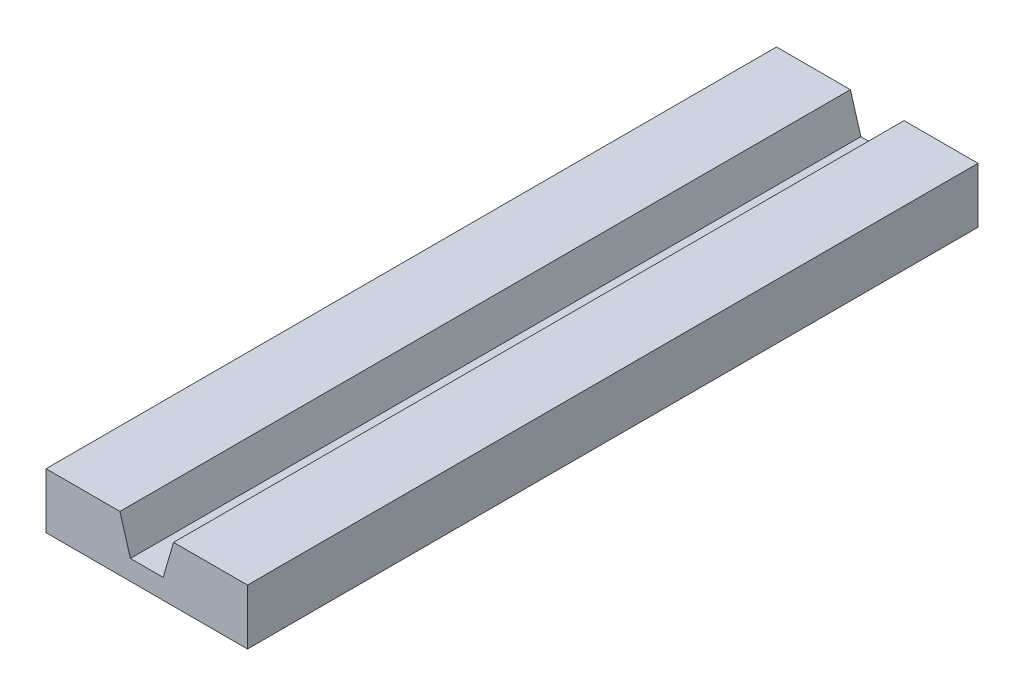
ISO-10303-21;
HEADER;
FILE_DESCRIPTION(('STEP AP214'),'2;1');
FILE_NAME('part.step','',(''),(''),'','','');
FILE_SCHEMA(('AUTOMOTIVE_DESIGN { 1 0 10303 214 1 1 1 1 }'));
ENDSEC;
DATA;
#1=APPLICATION_CONTEXT('core data for automotive mechanical design processes');
#2=APPLICATION_PROTOCOL_DEFINITION('international standard','automotive_design',2000,#1);
#3=PRODUCT_CONTEXT('',#1,'mechanical');
#4=PRODUCT('Part','Part','',(#3));
#5=PRODUCT_RELATED_PRODUCT_CATEGORY('part','',(#4));
#6=PRODUCT_DEFINITION_FORMATION('','',#4);
#7=PRODUCT_DEFINITION_CONTEXT('part definition',#1,'design');
#8=PRODUCT_DEFINITION('design','',#6,#7);
#9=PRODUCT_DEFINITION_SHAPE('','',#8);
#10=(LENGTH_UNIT() NAMED_UNIT(*) SI_UNIT(.MILLI.,.METRE.));
#11=(NAMED_UNIT(*) PLANE_ANGLE_UNIT() SI_UNIT($,.RADIAN.));
#12=(NAMED_UNIT(*) SI_UNIT($,.STERADIAN.) SOLID_ANGLE_UNIT());
#13=UNCERTAINTY_MEASURE_WITH_UNIT(LENGTH_MEASURE(1.E-05),#10,'distance_accuracy_value','');
#14=(GEOMETRIC_REPRESENTATION_CONTEXT(3) GLOBAL_UNCERTAINTY_ASSIGNED_CONTEXT((#13)) GLOBAL_UNIT_ASSIGNED_CONTEXT((#10,
#11,#12)) REPRESENTATION_CONTEXT('',''));
#15=CARTESIAN_POINT('',(0.,0.,0.));
#16=DIRECTION('',(0.,0.,1.));
#17=DIRECTION('',(1.,0.,0.));
#18=AXIS2_PLACEMENT_3D('',#15,#16,#17);
#19=CARTESIAN_POINT('',(-40.,-7.9,-290.));
#20=DIRECTION('',(0.,-1.,0.));
#21=DIRECTION('',(0.,0.,-1.));
#22=AXIS2_PLACEMENT_3D('',#19,#20,#21);
#23=PLANE('',#22);
#24=DIRECTION('',(1.,0.,0.));
#25=VECTOR('',#24,1.);
#26=CARTESIAN_POINT('',(-40.,-7.9,0.));
#27=LINE('',#26,#25);
#28=CARTESIAN_POINT('',(-40.,-7.9,0.));
#29=VERTEX_POINT('',#28);
#30=CARTESIAN_POINT('',(40.,-7.9,0.));
#31=VERTEX_POINT('',#30);
#32=EDGE_CURVE('E136',#29,#31,#27,.T.);
#33=ORIENTED_EDGE('',*,*,#32,.F.);
#34=DIRECTION('',(0.,0.,1.));
#35=VECTOR('',#34,1.);
#36=CARTESIAN_POINT('',(-40.,-7.9,-290.));
#37=LINE('',#36,#35);
#38=CARTESIAN_POINT('',(-40.,-7.9,-290.));
#39=VERTEX_POINT('',#38);
#40=EDGE_CURVE('E11',#39,#29,#37,.T.);
#41=ORIENTED_EDGE('',*,*,#40,.F.);
#42=DIRECTION('',(1.,0.,0.));
#43=VECTOR('',#42,1.);
#44=CARTESIAN_POINT('',(-40.,-7.9,-290.));
#45=LINE('',#44,#43);
#46=CARTESIAN_POINT('',(40.,-7.9,-290.));
#47=VERTEX_POINT('',#46);
#48=EDGE_CURVE('E156',#39,#47,#45,.T.);
#49=ORIENTED_EDGE('',*,*,#48,.T.);
#50=DIRECTION('',(0.,0.,1.));
#51=VECTOR('',#50,1.);
#52=CARTESIAN_POINT('',(40.,-7.9,-290.));
#53=LINE('',#52,#51);
#54=EDGE_CURVE('E42',#47,#31,#53,.T.);
#55=ORIENTED_EDGE('',*,*,#54,.T.);
#56=EDGE_LOOP('',(#33,#41,#49,#55));
#57=FACE_BOUND('',#56,.T.);
#58=ADVANCED_FACE('F39',(#57),#23,.T.);
#59=CARTESIAN_POINT('',(-40.,14.1,-290.));
#60=DIRECTION('',(-1.,0.,0.));
#61=DIRECTION('',(0.,-1.,0.));
#62=AXIS2_PLACEMENT_3D('',#59,#60,#61);
#63=PLANE('',#62);
#64=DIRECTION('',(0.,-1.,0.));
#65=VECTOR('',#64,1.);
#66=CARTESIAN_POINT('',(-40.,14.1,0.));
#67=LINE('',#66,#65);
#68=CARTESIAN_POINT('',(-40.,14.1,0.));
#69=VERTEX_POINT('',#68);
#70=EDGE_CURVE('E154',#69,#29,#67,.T.);
#71=ORIENTED_EDGE('',*,*,#70,.F.);
#72=DIRECTION('',(0.,0.,1.));
#73=VECTOR('',#72,1.);
#74=CARTESIAN_POINT('',(-40.,14.1,-290.));
#75=LINE('',#74,#73);
#76=CARTESIAN_POINT('',(-40.,14.1,-290.));
#77=VERTEX_POINT('',#76);
#78=EDGE_CURVE('E48',#77,#69,#75,.T.);
#79=ORIENTED_EDGE('',*,*,#78,.F.);
#80=DIRECTION('',(0.,-1.,0.));
#81=VECTOR('',#80,1.);
#82=CARTESIAN_POINT('',(-40.,14.1,-290.));
#83=LINE('',#82,#81);
#84=EDGE_CURVE('E126',#77,#39,#83,.T.);
#85=ORIENTED_EDGE('',*,*,#84,.T.);
#86=ORIENTED_EDGE('',*,*,#40,.T.);
#87=EDGE_LOOP('',(#71,#79,#85,#86));
#88=FACE_BOUND('',#87,.T.);
#89=ADVANCED_FACE('F168',(#88),#63,.T.);
#90=CARTESIAN_POINT('',(-40.,14.1,-290.));
#91=DIRECTION('',(0.,1.,0.));
#92=DIRECTION('',(0.,0.,1.));
#93=AXIS2_PLACEMENT_3D('',#90,#91,#92);
#94=PLANE('',#93);
#95=DIRECTION('',(-1.,0.,0.));
#96=VECTOR('',#95,1.);
#97=CARTESIAN_POINT('',(-40.,14.1,0.));
#98=LINE('',#97,#96);
#99=CARTESIAN_POINT('',(-10.65,14.1,0.));
#100=VERTEX_POINT('',#99);
#101=EDGE_CURVE('E113',#100,#69,#98,.T.);
#102=ORIENTED_EDGE('',*,*,#101,.F.);
#103=DIRECTION('',(0.,0.,1.));
#104=VECTOR('',#103,1.);
#105=CARTESIAN_POINT('',(-10.65,14.1,-290.));
#106=LINE('',#105,#104);
#107=CARTESIAN_POINT('',(-10.65,14.1,-290.));
#108=VERTEX_POINT('',#107);
#109=EDGE_CURVE('E108',#108,#100,#106,.T.);
#110=ORIENTED_EDGE('',*,*,#109,.F.);
#111=DIRECTION('',(-1.,0.,0.));
#112=VECTOR('',#111,1.);
#113=CARTESIAN_POINT('',(-40.,14.1,-290.));
#114=LINE('',#113,#112);
#115=EDGE_CURVE('E111',#108,#77,#114,.T.);
#116=ORIENTED_EDGE('',*,*,#115,.T.);
#117=ORIENTED_EDGE('',*,*,#78,.T.);
#118=EDGE_LOOP('',(#102,#110,#116,#117));
#119=FACE_BOUND('',#118,.T.);
#120=ADVANCED_FACE('F110',(#119),#94,.T.);
#121=CARTESIAN_POINT('',(-10.65,14.1,-290.));
#122=DIRECTION('',(0.959311314893196,0.282350493390551,0.));
#123=DIRECTION('',(-0.282350493390551,0.959311314893196,0.));
#124=AXIS2_PLACEMENT_3D('',#121,#122,#123);
#125=PLANE('',#124);
#126=DIRECTION('',(-0.282350493390551,0.959311314893196,0.));
#127=VECTOR('',#126,1.);
#128=CARTESIAN_POINT('',(-10.65,14.1,0.));
#129=LINE('',#128,#127);
#130=CARTESIAN_POINT('',(-6.5,0.,0.));
#131=VERTEX_POINT('',#130);
#132=EDGE_CURVE('E151',#131,#100,#129,.T.);
#133=ORIENTED_EDGE('',*,*,#132,.F.);
#134=DIRECTION('',(0.,0.,1.));
#135=VECTOR('',#134,1.);
#136=CARTESIAN_POINT('',(-6.5,0.,-290.));
#137=LINE('',#136,#135);
#138=CARTESIAN_POINT('',(-6.5,0.,-290.));
#139=VERTEX_POINT('',#138);
#140=EDGE_CURVE('E118',#139,#131,#137,.T.);
#141=ORIENTED_EDGE('',*,*,#140,.F.);
#142=DIRECTION('',(-0.282350493390551,0.959311314893196,0.));
#143=VECTOR('',#142,1.);
#144=CARTESIAN_POINT('',(-10.65,14.1,-290.));
#145=LINE('',#144,#143);
#146=EDGE_CURVE('E124',#139,#108,#145,.T.);
#147=ORIENTED_EDGE('',*,*,#146,.T.);
#148=ORIENTED_EDGE('',*,*,#109,.T.);
#149=EDGE_LOOP('',(#133,#141,#147,#148));
#150=FACE_BOUND('',#149,.T.);
#151=ADVANCED_FACE('F128',(#150),#125,.T.);
#152=CARTESIAN_POINT('',(-6.5,0.,-290.));
#153=DIRECTION('',(0.,1.,0.));
#154=DIRECTION('',(0.,0.,1.));
#155=AXIS2_PLACEMENT_3D('',#152,#153,#154);
#156=PLANE('',#155);
#157=DIRECTION('',(-1.,0.,0.));
#158=VECTOR('',#157,1.);
#159=CARTESIAN_POINT('',(-6.5,0.,0.));
#160=LINE('',#159,#158);
#161=CARTESIAN_POINT('',(6.5,0.,0.));
#162=VERTEX_POINT('',#161);
#163=EDGE_CURVE('E148',#162,#131,#160,.T.);
#164=ORIENTED_EDGE('',*,*,#163,.F.);
#165=DIRECTION('',(0.,0.,1.));
#166=VECTOR('',#165,1.);
#167=CARTESIAN_POINT('',(6.5,0.,-290.));
#168=LINE('',#167,#166);
#169=CARTESIAN_POINT('',(6.5,0.,-290.));
#170=VERTEX_POINT('',#169);
#171=EDGE_CURVE('E160',#170,#162,#168,.T.);
#172=ORIENTED_EDGE('',*,*,#171,.F.);
#173=DIRECTION('',(-1.,0.,0.));
#174=VECTOR('',#173,1.);
#175=CARTESIAN_POINT('',(-6.5,0.,-290.));
#176=LINE('',#175,#174);
#177=EDGE_CURVE('E129',#170,#139,#176,.T.);
#178=ORIENTED_EDGE('',*,*,#177,.T.);
#179=ORIENTED_EDGE('',*,*,#140,.T.);
#180=EDGE_LOOP('',(#164,#172,#178,#179));
#181=FACE_BOUND('',#180,.T.);
#182=ADVANCED_FACE('F181',(#181),#156,.T.);
#183=CARTESIAN_POINT('',(6.5,0.,-290.));
#184=DIRECTION('',(-0.959311314893196,0.282350493390551,0.));
#185=DIRECTION('',(-0.282350493390551,-0.959311314893196,0.));
#186=AXIS2_PLACEMENT_3D('',#183,#184,#185);
#187=PLANE('',#186);
#188=DIRECTION('',(-0.282350493390551,-0.959311314893196,0.));
#189=VECTOR('',#188,1.);
#190=CARTESIAN_POINT('',(6.5,0.,0.));
#191=LINE('',#190,#189);
#192=CARTESIAN_POINT('',(10.65,14.1,0.));
#193=VERTEX_POINT('',#192);
#194=EDGE_CURVE('E145',#193,#162,#191,.T.);
#195=ORIENTED_EDGE('',*,*,#194,.F.);
#196=DIRECTION('',(0.,0.,1.));
#197=VECTOR('',#196,1.);
#198=CARTESIAN_POINT('',(10.65,14.1,-290.));
#199=LINE('',#198,#197);
#200=CARTESIAN_POINT('',(10.65,14.1,-290.));
#201=VERTEX_POINT('',#200);
#202=EDGE_CURVE('E162',#201,#193,#199,.T.);
#203=ORIENTED_EDGE('',*,*,#202,.F.);
#204=DIRECTION('',(-0.282350493390551,-0.959311314893196,0.));
#205=VECTOR('',#204,1.);
#206=CARTESIAN_POINT('',(6.5,0.,-290.));
#207=LINE('',#206,#205);
#208=EDGE_CURVE('E131',#201,#170,#207,.T.);
#209=ORIENTED_EDGE('',*,*,#208,.T.);
#210=ORIENTED_EDGE('',*,*,#171,.T.);
#211=EDGE_LOOP('',(#195,#203,#209,#210));
#212=FACE_BOUND('',#211,.T.);
#213=ADVANCED_FACE('F184',(#212),#187,.T.);
#214=CARTESIAN_POINT('',(10.65,14.1,-290.));
#215=DIRECTION('',(0.,1.,0.));
#216=DIRECTION('',(0.,0.,1.));
#217=AXIS2_PLACEMENT_3D('',#214,#215,#216);
#218=PLANE('',#217);
#219=DIRECTION('',(-1.,0.,0.));
#220=VECTOR('',#219,1.);
#221=CARTESIAN_POINT('',(10.65,14.1,0.));
#222=LINE('',#221,#220);
#223=CARTESIAN_POINT('',(40.,14.1,0.));
#224=VERTEX_POINT('',#223);
#225=EDGE_CURVE('E142',#224,#193,#222,.T.);
#226=ORIENTED_EDGE('',*,*,#225,.F.);
#227=DIRECTION('',(0.,0.,1.));
#228=VECTOR('',#227,1.);
#229=CARTESIAN_POINT('',(40.,14.1,-290.));
#230=LINE('',#229,#228);
#231=CARTESIAN_POINT('',(40.,14.1,-290.));
#232=VERTEX_POINT('',#231);
#233=EDGE_CURVE('E163',#232,#224,#230,.T.);
#234=ORIENTED_EDGE('',*,*,#233,.F.);
#235=DIRECTION('',(-1.,0.,0.));
#236=VECTOR('',#235,1.);
#237=CARTESIAN_POINT('',(10.65,14.1,-290.));
#238=LINE('',#237,#236);
#239=EDGE_CURVE('E239',#232,#201,#238,.T.);
#240=ORIENTED_EDGE('',*,*,#239,.T.);
#241=ORIENTED_EDGE('',*,*,#202,.T.);
#242=EDGE_LOOP('',(#226,#234,#240,#241));
#243=FACE_BOUND('',#242,.T.);
#244=ADVANCED_FACE('F188',(#243),#218,.T.);
#245=CARTESIAN_POINT('',(40.,-7.9,-290.));
#246=DIRECTION('',(1.,0.,0.));
#247=DIRECTION('',(0.,0.,-1.));
#248=AXIS2_PLACEMENT_3D('',#245,#246,#247);
#249=PLANE('',#248);
#250=DIRECTION('',(0.,1.,0.));
#251=VECTOR('',#250,1.);
#252=CARTESIAN_POINT('',(40.,-7.9,0.));
#253=LINE('',#252,#251);
#254=EDGE_CURVE('E139',#31,#224,#253,.T.);
#255=ORIENTED_EDGE('',*,*,#254,.F.);
#256=ORIENTED_EDGE('',*,*,#54,.F.);
#257=DIRECTION('',(0.,1.,0.));
#258=VECTOR('',#257,1.);
#259=CARTESIAN_POINT('',(40.,-7.9,-290.));
#260=LINE('',#259,#258);
#261=EDGE_CURVE('E240',#47,#232,#260,.T.);
#262=ORIENTED_EDGE('',*,*,#261,.T.);
#263=ORIENTED_EDGE('',*,*,#233,.T.);
#264=EDGE_LOOP('',(#255,#256,#262,#263));
#265=FACE_BOUND('',#264,.T.);
#266=ADVANCED_FACE('F165',(#265),#249,.T.);
#267=CARTESIAN_POINT('',(0.,0.,-290.));
#268=DIRECTION('',(0.,0.,1.));
#269=DIRECTION('',(1.,0.,0.));
#270=AXIS2_PLACEMENT_3D('',#267,#268,#269);
#271=PLANE('',#270);
#272=ORIENTED_EDGE('',*,*,#48,.F.);
#273=ORIENTED_EDGE('',*,*,#84,.F.);
#274=ORIENTED_EDGE('',*,*,#115,.F.);
#275=ORIENTED_EDGE('',*,*,#146,.F.);
#276=ORIENTED_EDGE('',*,*,#177,.F.);
#277=ORIENTED_EDGE('',*,*,#208,.F.);
#278=ORIENTED_EDGE('',*,*,#239,.F.);
#279=ORIENTED_EDGE('',*,*,#261,.F.);
#280=EDGE_LOOP('',(#272,#273,#274,#275,#276,#277,#278,#279));
#281=FACE_BOUND('',#280,.T.);
#282=ADVANCED_FACE('F122',(#281),#271,.F.);
#283=CARTESIAN_POINT('',(0.,0.,0.));
#284=DIRECTION('',(0.,0.,1.));
#285=DIRECTION('',(1.,0.,0.));
#286=AXIS2_PLACEMENT_3D('',#283,#284,#285);
#287=PLANE('',#286);
#288=ORIENTED_EDGE('',*,*,#32,.T.);
#289=ORIENTED_EDGE('',*,*,#254,.T.);
#290=ORIENTED_EDGE('',*,*,#225,.T.);
#291=ORIENTED_EDGE('',*,*,#194,.T.);
#292=ORIENTED_EDGE('',*,*,#163,.T.);
#293=ORIENTED_EDGE('',*,*,#132,.T.);
#294=ORIENTED_EDGE('',*,*,#101,.T.);
#295=ORIENTED_EDGE('',*,*,#70,.T.);
#296=EDGE_LOOP('',(#288,#289,#290,#291,#292,#293,#294,#295));
#297=FACE_BOUND('',#296,.T.);
#298=ADVANCED_FACE('F167',(#297),#287,.T.);
#299=CLOSED_SHELL('',(#58,#89,#120,#151,#182,#213,#244,#266,#282,#298));
#300=MANIFOLD_SOLID_BREP('B2',#299);
#301=ADVANCED_BREP_SHAPE_REPRESENTATION('',(#18,#300),#14);
#302=SHAPE_DEFINITION_REPRESENTATION(#9,#301);
ENDSEC;
END-ISO-10303-21;
